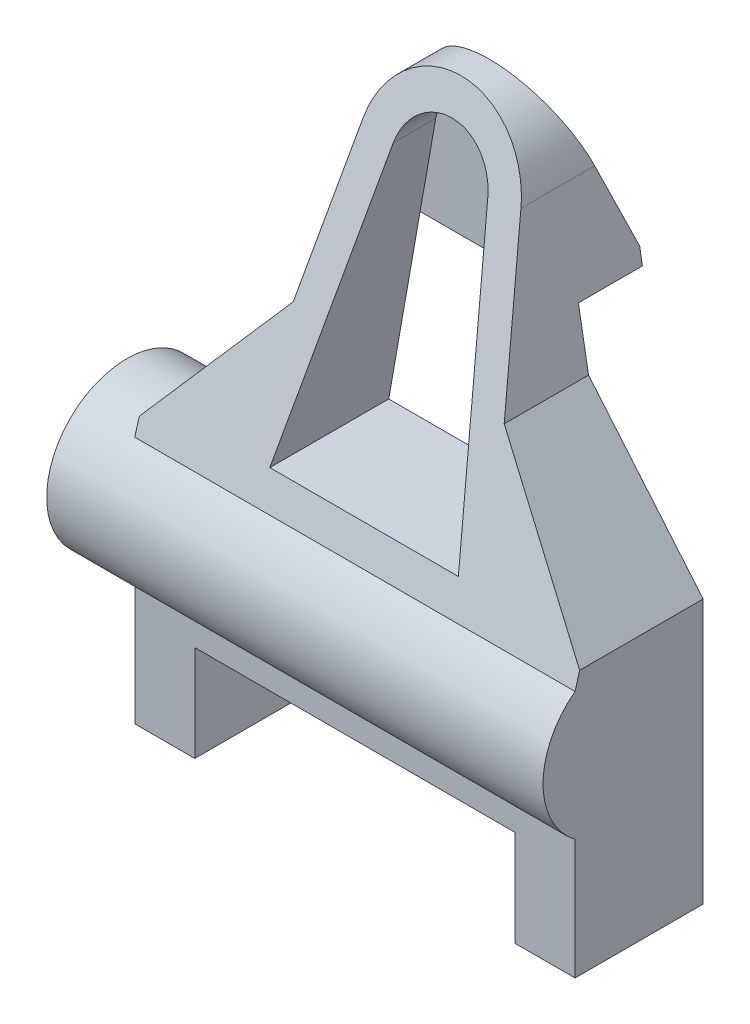
ISO-10303-21;
HEADER;
FILE_DESCRIPTION(('STEP AP214'),'2;1');
FILE_NAME('part.step','',(''),(''),'','','');
FILE_SCHEMA(('AUTOMOTIVE_DESIGN { 1 0 10303 214 1 1 1 1 }'));
ENDSEC;
DATA;
#1=APPLICATION_CONTEXT('core data for automotive mechanical design processes');
#2=APPLICATION_PROTOCOL_DEFINITION('international standard','automotive_design',2000,#1);
#3=PRODUCT_CONTEXT('',#1,'mechanical');
#4=PRODUCT('Part','Part','',(#3));
#5=PRODUCT_RELATED_PRODUCT_CATEGORY('part','',(#4));
#6=PRODUCT_DEFINITION_FORMATION('','',#4);
#7=PRODUCT_DEFINITION_CONTEXT('part definition',#1,'design');
#8=PRODUCT_DEFINITION('design','',#6,#7);
#9=PRODUCT_DEFINITION_SHAPE('','',#8);
#10=(LENGTH_UNIT() NAMED_UNIT(*) SI_UNIT(.MILLI.,.METRE.));
#11=(NAMED_UNIT(*) PLANE_ANGLE_UNIT() SI_UNIT($,.RADIAN.));
#12=(NAMED_UNIT(*) SI_UNIT($,.STERADIAN.) SOLID_ANGLE_UNIT());
#13=UNCERTAINTY_MEASURE_WITH_UNIT(LENGTH_MEASURE(1.E-05),#10,'distance_accuracy_value','');
#14=(GEOMETRIC_REPRESENTATION_CONTEXT(3) GLOBAL_UNCERTAINTY_ASSIGNED_CONTEXT((#13)) GLOBAL_UNIT_ASSIGNED_CONTEXT((#10,
#11,#12)) REPRESENTATION_CONTEXT('',''));
#15=CARTESIAN_POINT('',(0.,0.,0.));
#16=DIRECTION('',(0.,0.,1.));
#17=DIRECTION('',(1.,0.,0.));
#18=AXIS2_PLACEMENT_3D('',#15,#16,#17);
#19=CARTESIAN_POINT('',(77.5000000000003,4.77395900588817E-12,-8.27116153345742E-12));
#20=DIRECTION('',(-1.,0.,0.));
#21=DIRECTION('',(0.,0.,1.));
#22=AXIS2_PLACEMENT_3D('',#19,#20,#21);
#23=PLANE('',#22);
#24=CARTESIAN_POINT('',(77.5000000000003,4.77395900588817E-12,-8.27116153345742E-12));
#25=DIRECTION('',(-1.,0.,0.));
#26=DIRECTION('',(0.,0.,1.));
#27=AXIS2_PLACEMENT_3D('',#24,#25,#26);
#28=CIRCLE('',#27,5.50000000000007);
#29=CARTESIAN_POINT('',(77.5000000000003,4.77395900588817E-12,5.4999999999918));
#30=VERTEX_POINT('',#29);
#31=EDGE_CURVE('E19',#30,#30,#28,.T.);
#32=ORIENTED_EDGE('',*,*,#31,.T.);
#33=EDGE_LOOP('',(#32));
#34=FACE_BOUND('',#33,.T.);
#35=ADVANCED_FACE('F16',(#34),#23,.T.);
#36=CARTESIAN_POINT('',(77.5000000000003,4.77395900588817E-12,-8.27116153345742E-12));
#37=DIRECTION('',(-1.,0.,0.));
#38=DIRECTION('',(0.,0.,1.));
#39=AXIS2_PLACEMENT_3D('',#36,#37,#38);
#40=CYLINDRICAL_SURFACE('',#39,5.50000000000007);
#41=CARTESIAN_POINT('',(76.4999999999998,4.7740145170394E-12,-8.27159521432641E-12));
#42=DIRECTION('',(-1.,0.,0.));
#43=DIRECTION('',(0.,0.,1.));
#44=AXIS2_PLACEMENT_3D('',#41,#42,#43);
#45=CIRCLE('',#44,5.50000000000007);
#46=CARTESIAN_POINT('',(76.4999999999998,4.7740145170394E-12,5.4999999999918));
#47=VERTEX_POINT('',#46);
#48=EDGE_CURVE('E304',#47,#47,#45,.F.);
#49=ORIENTED_EDGE('',*,*,#48,.F.);
#50=EDGE_LOOP('',(#49));
#51=FACE_BOUND('',#50,.T.);
#52=ORIENTED_EDGE('',*,*,#31,.F.);
#53=EDGE_LOOP('',(#52));
#54=FACE_BOUND('',#53,.T.);
#55=ADVANCED_FACE('F312',(#51,#54),#40,.F.);
#56=CARTESIAN_POINT('',(76.4999999999998,4.77395900588817E-12,-8.27116153345742E-12));
#57=DIRECTION('',(-1.,0.,0.));
#58=DIRECTION('',(0.,0.,1.));
#59=AXIS2_PLACEMENT_3D('',#56,#57,#58);
#60=PLANE('',#59);
#61=CARTESIAN_POINT('',(76.4999999999998,4.77395900588817E-12,-8.27116153345742E-12));
#62=DIRECTION('',(-1.,0.,0.));
#63=DIRECTION('',(0.,0.,1.));
#64=AXIS2_PLACEMENT_3D('',#61,#62,#63);
#65=CIRCLE('',#64,6.50000000000009);
#66=CARTESIAN_POINT('',(76.4999999999998,4.77395900588817E-12,6.49999999999182));
#67=VERTEX_POINT('',#66);
#68=EDGE_CURVE('E302',#67,#67,#65,.T.);
#69=ORIENTED_EDGE('',*,*,#68,.T.);
#70=EDGE_LOOP('',(#69));
#71=FACE_BOUND('',#70,.T.);
#72=ORIENTED_EDGE('',*,*,#48,.T.);
#73=EDGE_LOOP('',(#72));
#74=FACE_BOUND('',#73,.T.);
#75=ADVANCED_FACE('F314',(#71,#74),#60,.T.);
#76=CARTESIAN_POINT('',(76.4999999999998,4.77395900588817E-12,-8.27116153345742E-12));
#77=DIRECTION('',(-1.,0.,0.));
#78=DIRECTION('',(0.,0.,1.));
#79=AXIS2_PLACEMENT_3D('',#76,#77,#78);
#80=CYLINDRICAL_SURFACE('',#79,6.50000000000009);
#81=CARTESIAN_POINT('',(71.4999999999999,4.77423656164433E-12,-8.27332993780239E-12));
#82=DIRECTION('',(-1.,0.,0.));
#83=DIRECTION('',(0.,0.,1.));
#84=AXIS2_PLACEMENT_3D('',#81,#82,#83);
#85=CIRCLE('',#84,6.50000000000009);
#86=CARTESIAN_POINT('',(71.4999999999999,4.77423656164433E-12,6.49999999999181));
#87=VERTEX_POINT('',#86);
#88=EDGE_CURVE('E299',#87,#87,#85,.F.);
#89=ORIENTED_EDGE('',*,*,#88,.F.);
#90=EDGE_LOOP('',(#89));
#91=FACE_BOUND('',#90,.T.);
#92=ORIENTED_EDGE('',*,*,#68,.F.);
#93=EDGE_LOOP('',(#92));
#94=FACE_BOUND('',#93,.T.);
#95=ADVANCED_FACE('F321',(#91,#94),#80,.F.);
#96=CARTESIAN_POINT('',(71.4999999999999,4.66293670342566E-12,-6.49480469405717E-12));
#97=DIRECTION('',(-1.,0.,0.));
#98=DIRECTION('',(0.,0.,1.));
#99=AXIS2_PLACEMENT_3D('',#96,#97,#98);
#100=PLANE('',#99);
#101=CARTESIAN_POINT('',(71.4999999999999,4.66293670342566E-12,-6.49480469405717E-12));
#102=DIRECTION('',(-1.,0.,0.));
#103=DIRECTION('',(0.,0.,1.));
#104=AXIS2_PLACEMENT_3D('',#101,#102,#103);
#105=CIRCLE('',#104,9.00000000000012);
#106=CARTESIAN_POINT('',(71.4999999999999,4.66293670342566E-12,8.99999999999362));
#107=VERTEX_POINT('',#106);
#108=EDGE_CURVE('E296',#107,#107,#105,.T.);
#109=ORIENTED_EDGE('',*,*,#108,.T.);
#110=EDGE_LOOP('',(#109));
#111=FACE_BOUND('',#110,.T.);
#112=ORIENTED_EDGE('',*,*,#88,.T.);
#113=EDGE_LOOP('',(#112));
#114=FACE_BOUND('',#113,.T.);
#115=ADVANCED_FACE('F434',(#111,#114),#100,.T.);
#116=CARTESIAN_POINT('',(71.4999999999999,4.66293670342566E-12,-6.49480469405717E-12));
#117=DIRECTION('',(-1.,0.,0.));
#118=DIRECTION('',(0.,0.,1.));
#119=AXIS2_PLACEMENT_3D('',#116,#117,#118);
#120=CYLINDRICAL_SURFACE('',#119,9.00000000000012);
#121=CARTESIAN_POINT('',(20.5000000000004,4.66576777213845E-12,-6.51692241837587E-12));
#122=DIRECTION('',(-1.,0.,0.));
#123=DIRECTION('',(0.,0.,1.));
#124=AXIS2_PLACEMENT_3D('',#121,#122,#123);
#125=CIRCLE('',#124,9.00000000000012);
#126=CARTESIAN_POINT('',(20.5000000000004,4.66576777213845E-12,8.9999999999936));
#127=VERTEX_POINT('',#126);
#128=EDGE_CURVE('E216',#127,#127,#125,.F.);
#129=ORIENTED_EDGE('',*,*,#128,.F.);
#130=EDGE_LOOP('',(#129));
#131=FACE_BOUND('',#130,.T.);
#132=ORIENTED_EDGE('',*,*,#108,.F.);
#133=EDGE_LOOP('',(#132));
#134=FACE_BOUND('',#133,.T.);
#135=ADVANCED_FACE('F430',(#131,#134),#120,.F.);
#136=CARTESIAN_POINT('',(20.5000000000004,0.,-5.99520433297585E-12));
#137=DIRECTION('',(-1.,0.,0.));
#138=DIRECTION('',(0.,0.,1.));
#139=AXIS2_PLACEMENT_3D('',#136,#137,#138);
#140=PLANE('',#139);
#141=CARTESIAN_POINT('',(20.5000000000004,0.,-5.99520433297585E-12));
#142=DIRECTION('',(1.,0.,0.));
#143=DIRECTION('',(0.,0.,-1.));
#144=AXIS2_PLACEMENT_3D('',#141,#142,#143);
#145=CIRCLE('',#144,10.0000000000001);
#146=CARTESIAN_POINT('',(20.5000000000004,0.,-10.0000000000061));
#147=VERTEX_POINT('',#146);
#148=EDGE_CURVE('E191',#147,#147,#145,.T.);
#149=ORIENTED_EDGE('',*,*,#148,.F.);
#150=EDGE_LOOP('',(#149));
#151=FACE_BOUND('',#150,.T.);
#152=ORIENTED_EDGE('',*,*,#128,.T.);
#153=EDGE_LOOP('',(#152));
#154=FACE_BOUND('',#153,.T.);
#155=ADVANCED_FACE('F426',(#151,#154),#140,.T.);
#156=CARTESIAN_POINT('',(55.0000000000003,44.2401960784322,-10.0000000000046));
#157=DIRECTION('',(0.,0.,1.));
#158=DIRECTION('',(1.,0.,0.));
#159=AXIS2_PLACEMENT_3D('',#156,#157,#158);
#160=CYLINDRICAL_SURFACE('',#159,6.);
#161=CARTESIAN_POINT('',(55.0000000000003,44.2401960784322,-9.99999999999828));
#162=DIRECTION('',(0.,0.,1.));
#163=DIRECTION('',(1.,0.,0.));
#164=AXIS2_PLACEMENT_3D('',#161,#162,#163);
#165=CIRCLE('',#164,6.);
#166=CARTESIAN_POINT('',(60.9088465180742,45.2820851444379,-9.99999999999576));
#167=VERTEX_POINT('',#166);
#168=CARTESIAN_POINT('',(49.0911534819261,45.2820851444336,-10.0000000000009));
#169=VERTEX_POINT('',#168);
#170=EDGE_CURVE('E275',#167,#169,#165,.T.);
#171=ORIENTED_EDGE('',*,*,#170,.F.);
#172=DIRECTION('',(0.,0.,1.));
#173=VECTOR('',#172,1.);
#174=CARTESIAN_POINT('',(60.9088465180735,45.2820851444418,-9.99999999999829));
#175=LINE('',#174,#173);
#176=CARTESIAN_POINT('',(60.9088465180735,45.2820851444378,-4.69046588663639));
#177=VERTEX_POINT('',#176);
#178=EDGE_CURVE('E262',#167,#177,#175,.T.);
#179=ORIENTED_EDGE('',*,*,#178,.T.);
#180=CARTESIAN_POINT('',(55.0000000000003,44.2401960784322,-4.39170900448593));
#181=DIRECTION('',(0.,-0.275637355816987,-0.961261695938322));
#182=DIRECTION('',(0.,-0.961261695938322,0.275637355816987));
#183=AXIS2_PLACEMENT_3D('',#180,#181,#182);
#184=ELLIPSE('',#183,6.24179661516959,6.);
#185=CARTESIAN_POINT('',(49.0911534819266,45.2820851444335,-4.69046588663648));
#186=VERTEX_POINT('',#185);
#187=EDGE_CURVE('E190',#177,#186,#184,.F.);
#188=ORIENTED_EDGE('',*,*,#187,.T.);
#189=DIRECTION('',(0.,0.,1.));
#190=VECTOR('',#189,1.);
#191=CARTESIAN_POINT('',(49.091153481926,45.2820851444333,-10.0000000000017));
#192=LINE('',#191,#190);
#193=EDGE_CURVE('E274',#186,#169,#192,.F.);
#194=ORIENTED_EDGE('',*,*,#193,.T.);
#195=EDGE_LOOP('',(#171,#179,#188,#194));
#196=FACE_BOUND('',#195,.T.);
#197=ADVANCED_FACE('F422',(#196),#160,.F.);
#198=CARTESIAN_POINT('',(-98.8059770101617,-7.99999999999446,6.00000000000234));
#199=DIRECTION('',(0.,0.,-1.));
#200=DIRECTION('',(-1.,0.,0.));
#201=AXIS2_PLACEMENT_3D('',#198,#199,#200);
#202=PLANE('',#201);
#203=DIRECTION('',(0.,1.,0.));
#204=VECTOR('',#203,1.);
#205=CARTESIAN_POINT('',(35.0000000000003,-59.3467831059166,5.9999999999934));
#206=LINE('',#205,#204);
#207=CARTESIAN_POINT('',(35.0000000000003,-22.9999999999961,5.99999999999577));
#208=VERTEX_POINT('',#207);
#209=CARTESIAN_POINT('',(35.0000000000003,-10.9999999999956,5.9999999999981));
#210=VERTEX_POINT('',#209);
#211=EDGE_CURVE('E217',#208,#210,#206,.T.);
#212=ORIENTED_EDGE('',*,*,#211,.T.);
#213=DIRECTION('',(1.,0.,0.));
#214=VECTOR('',#213,1.);
#215=CARTESIAN_POINT('',(35.,-10.9999999999978,6.0000000000075));
#216=LINE('',#215,#214);
#217=CARTESIAN_POINT('',(75.0000000000004,-10.9999999999978,6.00000000000685));
#218=VERTEX_POINT('',#217);
#219=EDGE_CURVE('E222',#210,#218,#216,.T.);
#220=ORIENTED_EDGE('',*,*,#219,.T.);
#221=DIRECTION('',(0.,1.,0.));
#222=VECTOR('',#221,1.);
#223=CARTESIAN_POINT('',(75.0000000000002,-59.3467831059185,6.00000000000556));
#224=LINE('',#223,#222);
#225=CARTESIAN_POINT('',(75.0000000000003,-22.999999999996,6.0000000000026));
#226=VERTEX_POINT('',#225);
#227=EDGE_CURVE('E224',#218,#226,#224,.F.);
#228=ORIENTED_EDGE('',*,*,#227,.T.);
#229=DIRECTION('',(1.,0.,0.));
#230=VECTOR('',#229,1.);
#231=CARTESIAN_POINT('',(27.4999999999993,-22.9999999999961,5.99999999999667));
#232=LINE('',#231,#230);
#233=CARTESIAN_POINT('',(82.5,-22.9999999999959,5.99999999999825));
#234=VERTEX_POINT('',#233);
#235=EDGE_CURVE('E232',#226,#234,#232,.T.);
#236=ORIENTED_EDGE('',*,*,#235,.T.);
#237=DIRECTION('',(0.,1.,0.));
#238=VECTOR('',#237,1.);
#239=CARTESIAN_POINT('',(82.5000000000001,-22.9999999999956,6.00000000000139));
#240=LINE('',#239,#238);
#241=CARTESIAN_POINT('',(82.5,-7.99999999999422,6.00000000000191));
#242=VERTEX_POINT('',#241);
#243=EDGE_CURVE('E287',#234,#242,#240,.T.);
#244=ORIENTED_EDGE('',*,*,#243,.T.);
#245=DIRECTION('',(-1.,0.,0.));
#246=VECTOR('',#245,1.);
#247=CARTESIAN_POINT('',(-98.8059770101617,-7.99999999999379,6.00000000000234));
#248=LINE('',#247,#246);
#249=CARTESIAN_POINT('',(27.4999999999999,-7.99999999999527,6.00000000000048));
#250=VERTEX_POINT('',#249);
#251=EDGE_CURVE('E214',#250,#242,#248,.F.);
#252=ORIENTED_EDGE('',*,*,#251,.F.);
#253=DIRECTION('',(0.,1.,0.));
#254=VECTOR('',#253,1.);
#255=CARTESIAN_POINT('',(27.4999999999999,10.0000000000033,5.99999999999856));
#256=LINE('',#255,#254);
#257=CARTESIAN_POINT('',(27.4999999999999,-22.999999999996,5.99999999999803));
#258=VERTEX_POINT('',#257);
#259=EDGE_CURVE('E285',#250,#258,#256,.F.);
#260=ORIENTED_EDGE('',*,*,#259,.T.);
#261=DIRECTION('',(1.,0.,0.));
#262=VECTOR('',#261,1.);
#263=CARTESIAN_POINT('',(27.4999999999993,-22.9999999999961,5.99999999999695));
#264=LINE('',#263,#262);
#265=EDGE_CURVE('E208',#258,#208,#264,.T.);
#266=ORIENTED_EDGE('',*,*,#265,.T.);
#267=EDGE_LOOP('',(#212,#220,#228,#236,#244,#252,#260,#266));
#268=FACE_BOUND('',#267,.T.);
#269=ADVANCED_FACE('F418',(#268),#202,.F.);
#270=CARTESIAN_POINT('',(20.5000000000004,0.,-5.99520433297585E-12));
#271=DIRECTION('',(1.,0.,0.));
#272=DIRECTION('',(0.,0.,-1.));
#273=AXIS2_PLACEMENT_3D('',#270,#271,#272);
#274=CYLINDRICAL_SURFACE('',#273,10.0000000000001);
#275=ORIENTED_EDGE('',*,*,#148,.T.);
#276=EDGE_LOOP('',(#275));
#277=FACE_BOUND('',#276,.T.);
#278=CARTESIAN_POINT('',(27.4999999999999,0.,-5.99216856689289E-12));
#279=DIRECTION('',(1.,0.,0.));
#280=DIRECTION('',(0.,0.,-1.));
#281=AXIS2_PLACEMENT_3D('',#278,#279,#280);
#282=CIRCLE('',#281,10.0000000000001);
#283=CARTESIAN_POINT('',(27.4999999999999,10.0000000000023,-6.63271142902876E-13));
#284=VERTEX_POINT('',#283);
#285=CARTESIAN_POINT('',(27.4999999999999,2.8863855749961E-12,-10.0000000000054));
#286=VERTEX_POINT('',#285);
#287=EDGE_CURVE('E279',#284,#286,#282,.F.);
#288=ORIENTED_EDGE('',*,*,#287,.T.);
#289=CARTESIAN_POINT('',(27.4999999999999,0.,-5.99216856689289E-12));
#290=DIRECTION('',(1.,0.,0.));
#291=DIRECTION('',(0.,0.,-1.));
#292=AXIS2_PLACEMENT_3D('',#289,#290,#291);
#293=CIRCLE('',#292,10.0000000000001);
#294=EDGE_CURVE('E283',#286,#250,#293,.F.);
#295=ORIENTED_EDGE('',*,*,#294,.T.);
#296=ORIENTED_EDGE('',*,*,#251,.T.);
#297=CARTESIAN_POINT('',(82.5,0.,-5.9683161190982E-12));
#298=DIRECTION('',(1.,0.,0.));
#299=DIRECTION('',(0.,0.,-1.));
#300=AXIS2_PLACEMENT_3D('',#297,#298,#299);
#301=CIRCLE('',#300,10.0000000000001);
#302=CARTESIAN_POINT('',(82.5,8.00000000000415,5.99999999999349));
#303=VERTEX_POINT('',#302);
#304=EDGE_CURVE('E176',#242,#303,#301,.F.);
#305=ORIENTED_EDGE('',*,*,#304,.T.);
#306=DIRECTION('',(1.,0.,0.));
#307=VECTOR('',#306,1.);
#308=CARTESIAN_POINT('',(-98.8059770101617,8.00000000000512,5.99999999999702));
#309=LINE('',#308,#307);
#310=CARTESIAN_POINT('',(27.4999999999999,8.00000000000054,5.99999999999831));
#311=VERTEX_POINT('',#310);
#312=EDGE_CURVE('E169',#303,#311,#309,.F.);
#313=ORIENTED_EDGE('',*,*,#312,.T.);
#314=CARTESIAN_POINT('',(27.4999999999999,0.,-5.99216856689289E-12));
#315=DIRECTION('',(1.,0.,0.));
#316=DIRECTION('',(0.,0.,-1.));
#317=AXIS2_PLACEMENT_3D('',#314,#315,#316);
#318=CIRCLE('',#317,10.0000000000001);
#319=EDGE_CURVE('E173',#311,#284,#318,.F.);
#320=ORIENTED_EDGE('',*,*,#319,.T.);
#321=EDGE_LOOP('',(#288,#295,#296,#305,#313,#320));
#322=FACE_BOUND('',#321,.T.);
#323=ADVANCED_FACE('F172',(#277,#322),#274,.T.);
#324=CARTESIAN_POINT('',(27.4999999999999,10.0000000000033,9.9999999999979));
#325=DIRECTION('',(1.,0.,0.));
#326=DIRECTION('',(0.,0.,-1.));
#327=AXIS2_PLACEMENT_3D('',#324,#325,#326);
#328=PLANE('',#327);
#329=DIRECTION('',(0.,0.961261695938322,-0.275637355816987));
#330=VECTOR('',#329,1.);
#331=CARTESIAN_POINT('',(27.4999999999999,8.000000000004,5.99999999999732));
#332=LINE('',#331,#330);
#333=CARTESIAN_POINT('',(27.5000000000002,10.0000000000035,5.42650922848301));
#334=VERTEX_POINT('',#333);
#335=EDGE_CURVE('E180',#311,#334,#332,.T.);
#336=ORIENTED_EDGE('',*,*,#335,.T.);
#337=DIRECTION('',(0.,0.,1.));
#338=VECTOR('',#337,1.);
#339=CARTESIAN_POINT('',(27.5000000000003,10.0000000000039,9.9999999999979));
#340=LINE('',#339,#338);
#341=EDGE_CURVE('E188',#334,#284,#340,.F.);
#342=ORIENTED_EDGE('',*,*,#341,.T.);
#343=ORIENTED_EDGE('',*,*,#319,.F.);
#344=EDGE_LOOP('',(#336,#342,#343));
#345=FACE_BOUND('',#344,.T.);
#346=ADVANCED_FACE('F185',(#345),#328,.F.);
#347=CARTESIAN_POINT('',(55.0000000000003,44.2401960784367,10.000000000001));
#348=DIRECTION('',(0.,0.,-1.));
#349=DIRECTION('',(-1.,0.,0.));
#350=AXIS2_PLACEMENT_3D('',#347,#348,#349);
#351=CYLINDRICAL_SURFACE('',#350,10.);
#352=CARTESIAN_POINT('',(55.0000000000003,44.2401960784367,-4.3917090044872));
#353=DIRECTION('',(0.,-0.275637355816987,-0.961261695938322));
#354=DIRECTION('',(0.,0.961261695938322,-0.275637355816987));
#355=AXIS2_PLACEMENT_3D('',#352,#353,#354);
#356=ELLIPSE('',#355,10.402994358616,10.);
#357=CARTESIAN_POINT('',(45.1519224698776,45.9766778551057,-4.88963714139607));
#358=VERTEX_POINT('',#357);
#359=CARTESIAN_POINT('',(64.8480775301221,45.9766778551037,-4.88963714139953));
#360=VERTEX_POINT('',#359);
#361=EDGE_CURVE('E181',#358,#360,#356,.T.);
#362=ORIENTED_EDGE('',*,*,#361,.T.);
#363=DIRECTION('',(0.,0.,1.));
#364=VECTOR('',#363,1.);
#365=CARTESIAN_POINT('',(64.8480775301218,45.9766778551013,9.99999999999473));
#366=LINE('',#365,#364);
#367=CARTESIAN_POINT('',(64.8480775301218,45.9766778551013,-14.1049598850533));
#368=VERTEX_POINT('',#367);
#369=EDGE_CURVE('E247',#360,#368,#366,.F.);
#370=ORIENTED_EDGE('',*,*,#369,.T.);
#371=CARTESIAN_POINT('',(55.0000000000003,44.2401960784367,-14.7985050279413));
#372=DIRECTION('',(0.,0.370907661604638,-0.928669751075687));
#373=DIRECTION('',(0.,-0.928669751075687,-0.370907661604638));
#374=AXIS2_PLACEMENT_3D('',#371,#372,#373);
#375=ELLIPSE('',#374,10.768090581627,10.);
#376=CARTESIAN_POINT('',(45.1519224698776,45.9766778551056,-14.1049598850547));
#377=VERTEX_POINT('',#376);
#378=EDGE_CURVE('E197',#377,#368,#375,.T.);
#379=ORIENTED_EDGE('',*,*,#378,.F.);
#380=DIRECTION('',(0.,0.,1.));
#381=VECTOR('',#380,1.);
#382=CARTESIAN_POINT('',(45.1519224698769,45.976677855105,10.));
#383=LINE('',#382,#381);
#384=EDGE_CURVE('E699',#377,#358,#383,.T.);
#385=ORIENTED_EDGE('',*,*,#384,.T.);
#386=EDGE_LOOP('',(#362,#370,#379,#385));
#387=FACE_BOUND('',#386,.T.);
#388=ADVANCED_FACE('F410',(#387),#351,.T.);
#389=CARTESIAN_POINT('',(-98.8059770101617,8.000000000004,5.99999999999734));
#390=DIRECTION('',(0.,-0.275637355816987,-0.961261695938322));
#391=DIRECTION('',(0.,0.961261695938322,-0.275637355816987));
#392=AXIS2_PLACEMENT_3D('',#389,#390,#391);
#393=PLANE('',#392);
#394=ORIENTED_EDGE('',*,*,#312,.F.);
#395=DIRECTION('',(0.,0.961261695940143,-0.275637355810636));
#396=VECTOR('',#395,1.);
#397=CARTESIAN_POINT('',(82.5000000000001,8.00000000000312,5.99999999999001));
#398=LINE('',#397,#396);
#399=CARTESIAN_POINT('',(82.4999999999996,10.0000000000049,5.42650922848608));
#400=VERTEX_POINT('',#399);
#401=EDGE_CURVE('E805',#303,#400,#398,.T.);
#402=ORIENTED_EDGE('',*,*,#401,.T.);
#403=DIRECTION('',(-0.627819760424347,0.748206454987355,-0.214544748563022));
#404=VECTOR('',#403,1.);
#405=CARTESIAN_POINT('',(82.4999999999987,10.0000000000041,5.42650922848609));
#406=LINE('',#405,#404);
#407=CARTESIAN_POINT('',(68.1832358499869,27.0620551101044,0.534043654092084));
#408=VERTEX_POINT('',#407);
#409=EDGE_CURVE('E238',#400,#408,#406,.T.);
#410=ORIENTED_EDGE('',*,*,#409,.T.);
#411=DIRECTION('',(-0.167112875584137,0.947744213124376,-0.271761279992678));
#412=VECTOR('',#411,1.);
#413=CARTESIAN_POINT('',(68.1832358499869,27.062055110103,0.534043654092209));
#414=LINE('',#413,#412);
#415=EDGE_CURVE('E244',#408,#360,#414,.T.);
#416=ORIENTED_EDGE('',*,*,#415,.T.);
#417=ORIENTED_EDGE('',*,*,#361,.F.);
#418=DIRECTION('',(-0.167112875584165,-0.947744213124537,0.271761279992097));
#419=VECTOR('',#418,1.);
#420=CARTESIAN_POINT('',(45.1519224698769,45.9766778551052,-4.88963714139073));
#421=LINE('',#420,#419);
#422=CARTESIAN_POINT('',(41.8167641500111,27.0620551101028,0.534043654087747));
#423=VERTEX_POINT('',#422);
#424=EDGE_CURVE('E701',#358,#423,#421,.T.);
#425=ORIENTED_EDGE('',*,*,#424,.T.);
#426=DIRECTION('',(-0.62781976042433,-0.748206454987332,0.214544748563153));
#427=VECTOR('',#426,1.);
#428=CARTESIAN_POINT('',(41.8167641500104,27.0620551101024,0.534043654088046));
#429=LINE('',#428,#427);
#430=EDGE_CURVE('E196',#423,#334,#429,.T.);
#431=ORIENTED_EDGE('',*,*,#430,.T.);
#432=ORIENTED_EDGE('',*,*,#335,.F.);
#433=EDGE_LOOP('',(#394,#402,#410,#416,#417,#425,#431,#432));
#434=FACE_BOUND('',#433,.T.);
#435=DIRECTION('',(1.,0.,0.));
#436=VECTOR('',#435,1.);
#437=CARTESIAN_POINT('',(43.222623896727,12.0000000000048,4.85301845696406));
#438=LINE('',#437,#436);
#439=CARTESIAN_POINT('',(66.7773761032742,12.0000000000039,4.85301845696406));
#440=VERTEX_POINT('',#439);
#441=CARTESIAN_POINT('',(43.2226238967267,12.000000000005,4.85301845696507));
#442=VERTEX_POINT('',#441);
#443=EDGE_CURVE('E266',#440,#442,#438,.F.);
#444=ORIENTED_EDGE('',*,*,#443,.T.);
#445=DIRECTION('',(0.167112875584109,0.947744213124218,-0.271761279993244));
#446=VECTOR('',#445,1.);
#447=CARTESIAN_POINT('',(43.2226238967268,12.0000000000033,4.85301845696774));
#448=LINE('',#447,#446);
#449=EDGE_CURVE('E271',#442,#186,#448,.T.);
#450=ORIENTED_EDGE('',*,*,#449,.T.);
#451=ORIENTED_EDGE('',*,*,#187,.F.);
#452=DIRECTION('',(0.167112875584118,-0.947744213124264,0.27176127999308));
#453=VECTOR('',#452,1.);
#454=CARTESIAN_POINT('',(60.9088465180746,45.2820851444357,-4.69046588663663));
#455=LINE('',#454,#453);
#456=EDGE_CURVE('E256',#177,#440,#455,.T.);
#457=ORIENTED_EDGE('',*,*,#456,.T.);
#458=EDGE_LOOP('',(#444,#450,#451,#457));
#459=FACE_BOUND('',#458,.T.);
#460=ADVANCED_FACE('F193',(#434,#459),#393,.F.);
#461=CARTESIAN_POINT('',(260.255959317303,59.0935715935432,-8.86611542134297));
#462=DIRECTION('',(0.,0.370907661604638,-0.928669751075687));
#463=DIRECTION('',(0.,0.928669751075687,0.370907661604638));
#464=AXIS2_PLACEMENT_3D('',#461,#462,#463);
#465=PLANE('',#464);
#466=DIRECTION('',(-1.,0.,0.));
#467=VECTOR('',#466,1.);
#468=CARTESIAN_POINT('',(55.0000000000005,36.2243693739779,-17.9999999999957));
#469=LINE('',#468,#467);
#470=CARTESIAN_POINT('',(43.4323273604623,36.2243693739752,-18.0000000000007));
#471=VERTEX_POINT('',#470);
#472=CARTESIAN_POINT('',(66.5676726395358,36.2243693739774,-17.9999999999947));
#473=VERTEX_POINT('',#472);
#474=EDGE_CURVE('E200',#471,#473,#469,.F.);
#475=ORIENTED_EDGE('',*,*,#474,.F.);
#476=DIRECTION('',(0.161597336850517,0.916464038579003,0.366032739948607));
#477=VECTOR('',#476,1.);
#478=CARTESIAN_POINT('',(43.4323273604623,36.2243693739781,-18.0000000000003));
#479=LINE('',#478,#477);
#480=EDGE_CURVE('E702',#471,#377,#479,.T.);
#481=ORIENTED_EDGE('',*,*,#480,.T.);
#482=ORIENTED_EDGE('',*,*,#378,.T.);
#483=DIRECTION('',(0.16159733685052,-0.916464038579007,-0.366032739948595));
#484=VECTOR('',#483,1.);
#485=CARTESIAN_POINT('',(64.8480775301219,45.9766778551006,-14.1049598850495));
#486=LINE('',#485,#484);
#487=EDGE_CURVE('E241',#368,#473,#486,.T.);
#488=ORIENTED_EDGE('',*,*,#487,.T.);
#489=EDGE_LOOP('',(#475,#481,#482,#488));
#490=FACE_BOUND('',#489,.T.);
#491=ADVANCED_FACE('F403',(#490),#465,.T.);
#492=CARTESIAN_POINT('',(55.0000000000005,44.2401960784335,-17.9999999999957));
#493=DIRECTION('',(0.,0.,-1.));
#494=DIRECTION('',(-1.,0.,0.));
#495=AXIS2_PLACEMENT_3D('',#492,#493,#494);
#496=PLANE('',#495);
#497=DIRECTION('',(0.173648177666927,-0.984807753012209,0.));
#498=VECTOR('',#497,1.);
#499=CARTESIAN_POINT('',(68.1832358499863,27.0620551101064,-17.9999999999942));
#500=LINE('',#499,#498);
#501=CARTESIAN_POINT('',(66.917535925941,34.240196078436,-18.0000000000052));
#502=VERTEX_POINT('',#501);
#503=EDGE_CURVE('E248',#473,#502,#500,.T.);
#504=ORIENTED_EDGE('',*,*,#503,.T.);
#505=DIRECTION('',(-1.,0.,0.));
#506=VECTOR('',#505,1.);
#507=CARTESIAN_POINT('',(66.9175359259409,34.240196078436,-18.0000000000106));
#508=LINE('',#507,#506);
#509=CARTESIAN_POINT('',(43.0824640740571,34.240196078436,-18.0000000000075));
#510=VERTEX_POINT('',#509);
#511=EDGE_CURVE('E694',#502,#510,#508,.T.);
#512=ORIENTED_EDGE('',*,*,#511,.T.);
#513=DIRECTION('',(0.173648177666926,0.984807753012209,0.));
#514=VECTOR('',#513,1.);
#515=CARTESIAN_POINT('',(41.8167641500124,27.06205511011,-18.0000000000043));
#516=LINE('',#515,#514);
#517=EDGE_CURVE('E705',#510,#471,#516,.T.);
#518=ORIENTED_EDGE('',*,*,#517,.T.);
#519=ORIENTED_EDGE('',*,*,#474,.T.);
#520=EDGE_LOOP('',(#504,#512,#518,#519));
#521=FACE_BOUND('',#520,.T.);
#522=ADVANCED_FACE('F399',(#521),#496,.T.);
#523=CARTESIAN_POINT('',(55.0000000000003,44.2401960784322,-10.0000000000046));
#524=DIRECTION('',(0.,0.,1.));
#525=DIRECTION('',(1.,0.,0.));
#526=AXIS2_PLACEMENT_3D('',#523,#524,#525);
#527=PLANE('',#526);
#528=ORIENTED_EDGE('',*,*,#170,.T.);
#529=DIRECTION('',(-0.173648177666926,-0.984807753012209,0.));
#530=VECTOR('',#529,1.);
#531=CARTESIAN_POINT('',(43.222623896727,12.0000000000048,-10.0000000000036));
#532=LINE('',#531,#530);
#533=CARTESIAN_POINT('',(47.1441705216005,34.2401960784359,-10.0000000000016));
#534=VERTEX_POINT('',#533);
#535=EDGE_CURVE('E268',#169,#534,#532,.T.);
#536=ORIENTED_EDGE('',*,*,#535,.T.);
#537=DIRECTION('',(-1.,0.,0.));
#538=VECTOR('',#537,1.);
#539=CARTESIAN_POINT('',(66.9175359259409,34.240196078436,-9.99999999999379));
#540=LINE('',#539,#538);
#541=CARTESIAN_POINT('',(62.8558294783986,34.2401960784371,-9.99999999999904));
#542=VERTEX_POINT('',#541);
#543=EDGE_CURVE('E662',#534,#542,#540,.F.);
#544=ORIENTED_EDGE('',*,*,#543,.T.);
#545=DIRECTION('',(-0.173648177666927,0.984807753012209,0.));
#546=VECTOR('',#545,1.);
#547=CARTESIAN_POINT('',(60.9088465180735,45.2820851444418,-9.99999999999324));
#548=LINE('',#547,#546);
#549=EDGE_CURVE('E265',#542,#167,#548,.T.);
#550=ORIENTED_EDGE('',*,*,#549,.T.);
#551=EDGE_LOOP('',(#528,#536,#544,#550));
#552=FACE_BOUND('',#551,.T.);
#553=ADVANCED_FACE('F395',(#552),#527,.T.);
#554=CARTESIAN_POINT('',(43.222623896727,12.0000000000048,-10.0000000000017));
#555=DIRECTION('',(-0.984807753012209,0.173648177666926,0.));
#556=DIRECTION('',(-0.173648177666926,-0.984807753012209,0.));
#557=AXIS2_PLACEMENT_3D('',#554,#555,#556);
#558=PLANE('',#557);
#559=DIRECTION('',(-0.173648177666901,-0.984807753012213,0.));
#560=VECTOR('',#559,1.);
#561=CARTESIAN_POINT('',(47.1441705216005,34.2401960784369,-10.0000000000046));
#562=LINE('',#561,#560);
#563=CARTESIAN_POINT('',(43.2226238967269,12.0000000000048,-10.0000000000046));
#564=VERTEX_POINT('',#563);
#565=EDGE_CURVE('E682',#534,#564,#562,.T.);
#566=ORIENTED_EDGE('',*,*,#565,.F.);
#567=ORIENTED_EDGE('',*,*,#535,.F.);
#568=ORIENTED_EDGE('',*,*,#193,.F.);
#569=ORIENTED_EDGE('',*,*,#449,.F.);
#570=DIRECTION('',(0.,0.,-1.));
#571=VECTOR('',#570,1.);
#572=CARTESIAN_POINT('',(43.2226238967265,12.0000000000048,-10.0000000000017));
#573=LINE('',#572,#571);
#574=EDGE_CURVE('E259',#442,#564,#573,.T.);
#575=ORIENTED_EDGE('',*,*,#574,.T.);
#576=EDGE_LOOP('',(#566,#567,#568,#569,#575));
#577=FACE_BOUND('',#576,.T.);
#578=ADVANCED_FACE('F391',(#577),#558,.F.);
#579=CARTESIAN_POINT('',(43.222623896727,12.0000000000048,-10.0000000000017));
#580=DIRECTION('',(0.,-1.,0.));
#581=DIRECTION('',(0.,0.,-1.));
#582=AXIS2_PLACEMENT_3D('',#579,#580,#581);
#583=PLANE('',#582);
#584=DIRECTION('',(-1.,0.,0.));
#585=VECTOR('',#584,1.);
#586=CARTESIAN_POINT('',(55.0000000000003,12.0000000000048,-10.0000000000046));
#587=LINE('',#586,#585);
#588=CARTESIAN_POINT('',(66.7773761032733,12.0000000000043,-10.0000000000046));
#589=VERTEX_POINT('',#588);
#590=EDGE_CURVE('E672',#564,#589,#587,.F.);
#591=ORIENTED_EDGE('',*,*,#590,.F.);
#592=ORIENTED_EDGE('',*,*,#574,.F.);
#593=ORIENTED_EDGE('',*,*,#443,.F.);
#594=DIRECTION('',(0.,0.,1.));
#595=VECTOR('',#594,1.);
#596=CARTESIAN_POINT('',(66.7773761032742,12.0000000000035,-9.99999999999829));
#597=LINE('',#596,#595);
#598=EDGE_CURVE('E258',#440,#589,#597,.F.);
#599=ORIENTED_EDGE('',*,*,#598,.T.);
#600=EDGE_LOOP('',(#591,#592,#593,#599));
#601=FACE_BOUND('',#600,.T.);
#602=ADVANCED_FACE('F387',(#601),#583,.F.);
#603=CARTESIAN_POINT('',(60.9088465180735,45.2820851444418,-9.99999999999829));
#604=DIRECTION('',(0.984807753012209,0.173648177666927,0.));
#605=DIRECTION('',(-0.173648177666927,0.984807753012209,0.));
#606=AXIS2_PLACEMENT_3D('',#603,#604,#605);
#607=PLANE('',#606);
#608=ORIENTED_EDGE('',*,*,#549,.F.);
#609=DIRECTION('',(-0.173648177666949,0.984807753012205,0.));
#610=VECTOR('',#609,1.);
#611=CARTESIAN_POINT('',(66.777376103273,12.000000000004,-10.0000000000046));
#612=LINE('',#611,#610);
#613=EDGE_CURVE('E827',#589,#542,#612,.T.);
#614=ORIENTED_EDGE('',*,*,#613,.F.);
#615=ORIENTED_EDGE('',*,*,#598,.F.);
#616=ORIENTED_EDGE('',*,*,#456,.F.);
#617=ORIENTED_EDGE('',*,*,#178,.F.);
#618=EDGE_LOOP('',(#608,#614,#615,#616,#617));
#619=FACE_BOUND('',#618,.T.);
#620=ADVANCED_FACE('F383',(#619),#607,.F.);
#621=CARTESIAN_POINT('',(68.1832358499863,27.0620551101064,9.99999999999473));
#622=DIRECTION('',(-0.984807753012209,-0.173648177666927,0.));
#623=DIRECTION('',(0.173648177666927,-0.984807753012209,0.));
#624=AXIS2_PLACEMENT_3D('',#621,#622,#623);
#625=PLANE('',#624);
#626=ORIENTED_EDGE('',*,*,#369,.F.);
#627=ORIENTED_EDGE('',*,*,#415,.F.);
#628=DIRECTION('',(0.,0.,1.));
#629=VECTOR('',#628,1.);
#630=CARTESIAN_POINT('',(68.1832358499871,27.0620551101044,9.99999999999679));
#631=LINE('',#630,#629);
#632=CARTESIAN_POINT('',(68.1832358499865,27.062055110105,-10.0000000000046));
#633=VERTEX_POINT('',#632);
#634=EDGE_CURVE('E240',#408,#633,#631,.F.);
#635=ORIENTED_EDGE('',*,*,#634,.T.);
#636=DIRECTION('',(0.173648177666867,-0.984807753012219,0.));
#637=VECTOR('',#636,1.);
#638=CARTESIAN_POINT('',(66.917535925941,34.2401960784369,-10.0000000000046));
#639=LINE('',#638,#637);
#640=CARTESIAN_POINT('',(66.917535925941,34.2401960784369,-10.0000000000008));
#641=VERTEX_POINT('',#640);
#642=EDGE_CURVE('E814',#641,#633,#639,.T.);
#643=ORIENTED_EDGE('',*,*,#642,.F.);
#644=DIRECTION('',(0.,0.,1.));
#645=VECTOR('',#644,1.);
#646=CARTESIAN_POINT('',(66.917535925941,34.240196078436,-18.0000000000106));
#647=LINE('',#646,#645);
#648=EDGE_CURVE('E696',#641,#502,#647,.F.);
#649=ORIENTED_EDGE('',*,*,#648,.T.);
#650=ORIENTED_EDGE('',*,*,#503,.F.);
#651=ORIENTED_EDGE('',*,*,#487,.F.);
#652=EDGE_LOOP('',(#626,#627,#635,#643,#649,#650,#651));
#653=FACE_BOUND('',#652,.T.);
#654=ADVANCED_FACE('F379',(#653),#625,.F.);
#655=CARTESIAN_POINT('',(82.4999999999998,10.0000000000027,9.99999999999679));
#656=DIRECTION('',(-0.766044443118979,-0.642787609686538,0.));
#657=DIRECTION('',(0.642787609686538,-0.766044443118979,0.));
#658=AXIS2_PLACEMENT_3D('',#655,#656,#657);
#659=PLANE('',#658);
#660=ORIENTED_EDGE('',*,*,#409,.F.);
#661=DIRECTION('',(0.,0.,1.));
#662=VECTOR('',#661,1.);
#663=CARTESIAN_POINT('',(82.5000000000001,10.0000000000053,9.99999999999856));
#664=LINE('',#663,#662);
#665=CARTESIAN_POINT('',(82.5000000000004,10.0000000000056,-10.0000000000046));
#666=VERTEX_POINT('',#665);
#667=EDGE_CURVE('E802',#400,#666,#664,.F.);
#668=ORIENTED_EDGE('',*,*,#667,.T.);
#669=DIRECTION('',(0.642787609686629,-0.766044443118903,0.));
#670=VECTOR('',#669,1.);
#671=CARTESIAN_POINT('',(68.1832358499862,27.0620551101053,-10.0000000000046));
#672=LINE('',#671,#670);
#673=EDGE_CURVE('E797',#633,#666,#672,.T.);
#674=ORIENTED_EDGE('',*,*,#673,.F.);
#675=ORIENTED_EDGE('',*,*,#634,.F.);
#676=EDGE_LOOP('',(#660,#668,#674,#675));
#677=FACE_BOUND('',#676,.T.);
#678=ADVANCED_FACE('F375',(#677),#659,.F.);
#679=CARTESIAN_POINT('',(82.5000000000001,-22.9999999999956,9.99999999999856));
#680=DIRECTION('',(-1.,0.,0.));
#681=DIRECTION('',(0.,0.,1.));
#682=AXIS2_PLACEMENT_3D('',#679,#680,#681);
#683=PLANE('',#682);
#684=ORIENTED_EDGE('',*,*,#243,.F.);
#685=DIRECTION('',(0.,0.,1.));
#686=VECTOR('',#685,1.);
#687=CARTESIAN_POINT('',(82.5,-22.9999999999961,10.0000000000033));
#688=LINE('',#687,#686);
#689=CARTESIAN_POINT('',(82.5000000000004,-22.9999999999957,-10.0000000000046));
#690=VERTEX_POINT('',#689);
#691=EDGE_CURVE('E235',#234,#690,#688,.F.);
#692=ORIENTED_EDGE('',*,*,#691,.T.);
#693=DIRECTION('',(0.,1.,0.));
#694=VECTOR('',#693,1.);
#695=CARTESIAN_POINT('',(82.5000000000005,44.2401960784322,-10.0000000000046));
#696=LINE('',#695,#694);
#697=EDGE_CURVE('E789',#666,#690,#696,.F.);
#698=ORIENTED_EDGE('',*,*,#697,.F.);
#699=ORIENTED_EDGE('',*,*,#667,.F.);
#700=ORIENTED_EDGE('',*,*,#401,.F.);
#701=ORIENTED_EDGE('',*,*,#304,.F.);
#702=EDGE_LOOP('',(#684,#692,#698,#699,#700,#701));
#703=FACE_BOUND('',#702,.T.);
#704=ADVANCED_FACE('F371',(#703),#683,.F.);
#705=CARTESIAN_POINT('',(27.4999999999993,-22.9999999999961,10.0000000000033));
#706=DIRECTION('',(0.,1.,0.));
#707=DIRECTION('',(0.,0.,1.));
#708=AXIS2_PLACEMENT_3D('',#705,#706,#707);
#709=PLANE('',#708);
#710=DIRECTION('',(0.,0.,-1.));
#711=VECTOR('',#710,1.);
#712=CARTESIAN_POINT('',(75.0000000000002,-22.9999999999959,9.99999999998968));
#713=LINE('',#712,#711);
#714=CARTESIAN_POINT('',(75.0000000000004,-22.9999999999956,-10.0000000000046));
#715=VERTEX_POINT('',#714);
#716=EDGE_CURVE('E229',#226,#715,#713,.T.);
#717=ORIENTED_EDGE('',*,*,#716,.T.);
#718=DIRECTION('',(-1.,0.,0.));
#719=VECTOR('',#718,1.);
#720=CARTESIAN_POINT('',(55.0000000000003,-22.9999999999955,-10.0000000000046));
#721=LINE('',#720,#719);
#722=EDGE_CURVE('E781',#690,#715,#721,.T.);
#723=ORIENTED_EDGE('',*,*,#722,.F.);
#724=ORIENTED_EDGE('',*,*,#691,.F.);
#725=ORIENTED_EDGE('',*,*,#235,.F.);
#726=EDGE_LOOP('',(#717,#723,#724,#725));
#727=FACE_BOUND('',#726,.T.);
#728=ADVANCED_FACE('F367',(#727),#709,.F.);
#729=CARTESIAN_POINT('',(75.0000000000002,-59.3467831059185,9.99999999998968));
#730=DIRECTION('',(1.,0.,0.));
#731=DIRECTION('',(0.,0.,-1.));
#732=AXIS2_PLACEMENT_3D('',#729,#730,#731);
#733=PLANE('',#732);
#734=DIRECTION('',(0.,0.,1.));
#735=VECTOR('',#734,1.);
#736=CARTESIAN_POINT('',(75.0000000000005,-10.9999999999978,9.9999999999994));
#737=LINE('',#736,#735);
#738=CARTESIAN_POINT('',(75.0000000000005,-10.9999999999939,-10.0000000000046));
#739=VERTEX_POINT('',#738);
#740=EDGE_CURVE('E219',#218,#739,#737,.F.);
#741=ORIENTED_EDGE('',*,*,#740,.T.);
#742=DIRECTION('',(0.,1.,0.));
#743=VECTOR('',#742,1.);
#744=CARTESIAN_POINT('',(75.0000000000005,44.2401960784322,-10.0000000000046));
#745=LINE('',#744,#743);
#746=EDGE_CURVE('E773',#715,#739,#745,.T.);
#747=ORIENTED_EDGE('',*,*,#746,.F.);
#748=ORIENTED_EDGE('',*,*,#716,.F.);
#749=ORIENTED_EDGE('',*,*,#227,.F.);
#750=EDGE_LOOP('',(#741,#747,#748,#749));
#751=FACE_BOUND('',#750,.T.);
#752=ADVANCED_FACE('F363',(#751),#733,.F.);
#753=CARTESIAN_POINT('',(35.,-10.9999999999978,9.9999999999994));
#754=DIRECTION('',(0.,1.,0.));
#755=DIRECTION('',(0.,0.,1.));
#756=AXIS2_PLACEMENT_3D('',#753,#754,#755);
#757=PLANE('',#756);
#758=DIRECTION('',(-1.,0.,0.));
#759=VECTOR('',#758,1.);
#760=CARTESIAN_POINT('',(55.0000000000003,-10.9999999999919,-10.0000000000046));
#761=LINE('',#760,#759);
#762=CARTESIAN_POINT('',(35.0000000000005,-10.9999999999928,-10.0000000000046));
#763=VERTEX_POINT('',#762);
#764=EDGE_CURVE('E765',#739,#763,#761,.T.);
#765=ORIENTED_EDGE('',*,*,#764,.F.);
#766=ORIENTED_EDGE('',*,*,#740,.F.);
#767=ORIENTED_EDGE('',*,*,#219,.F.);
#768=DIRECTION('',(0.,0.,1.));
#769=VECTOR('',#768,1.);
#770=CARTESIAN_POINT('',(35.0000000000003,-10.9999999999946,9.99999999999646));
#771=LINE('',#770,#769);
#772=EDGE_CURVE('E211',#210,#763,#771,.F.);
#773=ORIENTED_EDGE('',*,*,#772,.T.);
#774=EDGE_LOOP('',(#765,#766,#767,#773));
#775=FACE_BOUND('',#774,.T.);
#776=ADVANCED_FACE('F359',(#775),#757,.F.);
#777=CARTESIAN_POINT('',(35.0000000000003,-59.3467831059166,9.99999999999646));
#778=DIRECTION('',(-1.,0.,0.));
#779=DIRECTION('',(0.,0.,1.));
#780=AXIS2_PLACEMENT_3D('',#777,#778,#779);
#781=PLANE('',#780);
#782=ORIENTED_EDGE('',*,*,#772,.F.);
#783=ORIENTED_EDGE('',*,*,#211,.F.);
#784=DIRECTION('',(0.,0.,1.));
#785=VECTOR('',#784,1.);
#786=CARTESIAN_POINT('',(35.0000000000003,-22.9999999999961,10.0000000000033));
#787=LINE('',#786,#785);
#788=CARTESIAN_POINT('',(35.0000000000005,-22.9999999999944,-10.0000000000046));
#789=VERTEX_POINT('',#788);
#790=EDGE_CURVE('E210',#208,#789,#787,.F.);
#791=ORIENTED_EDGE('',*,*,#790,.T.);
#792=DIRECTION('',(0.,1.,0.));
#793=VECTOR('',#792,1.);
#794=CARTESIAN_POINT('',(35.0000000000006,44.2401960784322,-10.0000000000046));
#795=LINE('',#794,#793);
#796=EDGE_CURVE('E757',#763,#789,#795,.F.);
#797=ORIENTED_EDGE('',*,*,#796,.F.);
#798=EDGE_LOOP('',(#782,#783,#791,#797));
#799=FACE_BOUND('',#798,.T.);
#800=ADVANCED_FACE('F355',(#799),#781,.F.);
#801=CARTESIAN_POINT('',(27.4999999999993,-22.9999999999961,10.0000000000033));
#802=DIRECTION('',(0.,1.,0.));
#803=DIRECTION('',(0.,0.,1.));
#804=AXIS2_PLACEMENT_3D('',#801,#802,#803);
#805=PLANE('',#804);
#806=ORIENTED_EDGE('',*,*,#790,.F.);
#807=ORIENTED_EDGE('',*,*,#265,.F.);
#808=DIRECTION('',(0.,0.,-1.));
#809=VECTOR('',#808,1.);
#810=CARTESIAN_POINT('',(27.4999999999999,-22.9999999999959,9.9999999999979));
#811=LINE('',#810,#809);
#812=CARTESIAN_POINT('',(27.5000000000004,-22.9999999999943,-10.0000000000046));
#813=VERTEX_POINT('',#812);
#814=EDGE_CURVE('E282',#258,#813,#811,.T.);
#815=ORIENTED_EDGE('',*,*,#814,.T.);
#816=DIRECTION('',(-1.,0.,0.));
#817=VECTOR('',#816,1.);
#818=CARTESIAN_POINT('',(55.0000000000003,-22.9999999999935,-10.0000000000046));
#819=LINE('',#818,#817);
#820=EDGE_CURVE('E754',#789,#813,#819,.T.);
#821=ORIENTED_EDGE('',*,*,#820,.F.);
#822=EDGE_LOOP('',(#806,#807,#815,#821));
#823=FACE_BOUND('',#822,.T.);
#824=ADVANCED_FACE('F351',(#823),#805,.F.);
#825=CARTESIAN_POINT('',(27.4999999999999,10.0000000000033,9.9999999999979));
#826=DIRECTION('',(1.,0.,0.));
#827=DIRECTION('',(0.,0.,-1.));
#828=AXIS2_PLACEMENT_3D('',#825,#826,#827);
#829=PLANE('',#828);
#830=ORIENTED_EDGE('',*,*,#259,.F.);
#831=ORIENTED_EDGE('',*,*,#294,.F.);
#832=DIRECTION('',(0.,1.,0.));
#833=VECTOR('',#832,1.);
#834=CARTESIAN_POINT('',(27.5000000000007,44.2401960784322,-10.0000000000046));
#835=LINE('',#834,#833);
#836=EDGE_CURVE('E738',#813,#286,#835,.T.);
#837=ORIENTED_EDGE('',*,*,#836,.F.);
#838=ORIENTED_EDGE('',*,*,#814,.F.);
#839=EDGE_LOOP('',(#830,#831,#837,#838));
#840=FACE_BOUND('',#839,.T.);
#841=ADVANCED_FACE('F347',(#840),#829,.F.);
#842=CARTESIAN_POINT('',(27.4999999999999,10.0000000000033,9.9999999999979));
#843=DIRECTION('',(1.,0.,0.));
#844=DIRECTION('',(0.,0.,-1.));
#845=AXIS2_PLACEMENT_3D('',#842,#843,#844);
#846=PLANE('',#845);
#847=DIRECTION('',(0.,0.,1.));
#848=VECTOR('',#847,1.);
#849=CARTESIAN_POINT('',(27.5000000000007,10.0000000000044,9.9999999999979));
#850=LINE('',#849,#848);
#851=CARTESIAN_POINT('',(27.5000000000002,10.000000000005,-10.0000000000032));
#852=VERTEX_POINT('',#851);
#853=EDGE_CURVE('E281',#284,#852,#850,.F.);
#854=ORIENTED_EDGE('',*,*,#853,.T.);
#855=DIRECTION('',(0.,1.,0.));
#856=VECTOR('',#855,1.);
#857=CARTESIAN_POINT('',(27.5,44.2401960784322,-10.0000000000046));
#858=LINE('',#857,#856);
#859=EDGE_CURVE('E736',#286,#852,#858,.T.);
#860=ORIENTED_EDGE('',*,*,#859,.F.);
#861=ORIENTED_EDGE('',*,*,#287,.F.);
#862=EDGE_LOOP('',(#854,#860,#861));
#863=FACE_BOUND('',#862,.T.);
#864=ADVANCED_FACE('F343',(#863),#846,.F.);
#865=CARTESIAN_POINT('',(27.4999999999999,10.0000000000033,9.9999999999979));
#866=DIRECTION('',(0.766044443118978,-0.642787609686539,0.));
#867=DIRECTION('',(0.642787609686539,0.766044443118978,0.));
#868=AXIS2_PLACEMENT_3D('',#865,#866,#867);
#869=PLANE('',#868);
#870=ORIENTED_EDGE('',*,*,#430,.F.);
#871=DIRECTION('',(0.,0.,1.));
#872=VECTOR('',#871,1.);
#873=CARTESIAN_POINT('',(41.8167641500109,27.062055110102,10.));
#874=LINE('',#873,#872);
#875=CARTESIAN_POINT('',(41.8167641500116,27.0620551101038,-10.0000000000034));
#876=VERTEX_POINT('',#875);
#877=EDGE_CURVE('E710',#423,#876,#874,.F.);
#878=ORIENTED_EDGE('',*,*,#877,.T.);
#879=DIRECTION('',(0.64278760968657,0.766044443118952,0.));
#880=VECTOR('',#879,1.);
#881=CARTESIAN_POINT('',(27.5,10.0000000000058,-10.0000000000046));
#882=LINE('',#881,#880);
#883=EDGE_CURVE('E730',#852,#876,#882,.T.);
#884=ORIENTED_EDGE('',*,*,#883,.F.);
#885=ORIENTED_EDGE('',*,*,#853,.F.);
#886=ORIENTED_EDGE('',*,*,#341,.F.);
#887=EDGE_LOOP('',(#870,#878,#884,#885,#886));
#888=FACE_BOUND('',#887,.T.);
#889=ADVANCED_FACE('F340',(#888),#869,.F.);
#890=CARTESIAN_POINT('',(41.8167641500123,27.06205511011,10.));
#891=DIRECTION('',(0.984807753012209,-0.173648177666926,0.));
#892=DIRECTION('',(0.173648177666926,0.984807753012209,0.));
#893=AXIS2_PLACEMENT_3D('',#890,#891,#892);
#894=PLANE('',#893);
#895=ORIENTED_EDGE('',*,*,#517,.F.);
#896=DIRECTION('',(0.,0.,1.));
#897=VECTOR('',#896,1.);
#898=CARTESIAN_POINT('',(43.0824640740577,34.240196078436,-18.0000000000106));
#899=LINE('',#898,#897);
#900=CARTESIAN_POINT('',(43.0824640740573,34.2401960784359,-10.0000000000005));
#901=VERTEX_POINT('',#900);
#902=EDGE_CURVE('E34',#510,#901,#899,.T.);
#903=ORIENTED_EDGE('',*,*,#902,.T.);
#904=DIRECTION('',(0.173648177667012,0.984807753012193,0.));
#905=VECTOR('',#904,1.);
#906=CARTESIAN_POINT('',(41.8167641500115,27.0620551101046,-10.0000000000046));
#907=LINE('',#906,#905);
#908=EDGE_CURVE('E25',#876,#901,#907,.T.);
#909=ORIENTED_EDGE('',*,*,#908,.F.);
#910=ORIENTED_EDGE('',*,*,#877,.F.);
#911=ORIENTED_EDGE('',*,*,#424,.F.);
#912=ORIENTED_EDGE('',*,*,#384,.F.);
#913=ORIENTED_EDGE('',*,*,#480,.F.);
#914=EDGE_LOOP('',(#895,#903,#909,#910,#911,#912,#913));
#915=FACE_BOUND('',#914,.T.);
#916=ADVANCED_FACE('F333',(#915),#894,.F.);
#917=CARTESIAN_POINT('',(66.9175359259409,34.240196078436,-18.0000000000106));
#918=DIRECTION('',(0.,1.,0.));
#919=DIRECTION('',(-1.,0.,0.));
#920=AXIS2_PLACEMENT_3D('',#917,#918,#919);
#921=PLANE('',#920);
#922=ORIENTED_EDGE('',*,*,#543,.F.);
#923=DIRECTION('',(-1.,0.,0.));
#924=VECTOR('',#923,1.);
#925=CARTESIAN_POINT('',(55.0000000000003,34.2401960784358,-10.0000000000046));
#926=LINE('',#925,#924);
#927=EDGE_CURVE('E11',#901,#534,#926,.F.);
#928=ORIENTED_EDGE('',*,*,#927,.F.);
#929=ORIENTED_EDGE('',*,*,#902,.F.);
#930=ORIENTED_EDGE('',*,*,#511,.F.);
#931=ORIENTED_EDGE('',*,*,#648,.F.);
#932=DIRECTION('',(-1.,0.,0.));
#933=VECTOR('',#932,1.);
#934=CARTESIAN_POINT('',(55.0000000000003,34.2401960784373,-10.0000000000046));
#935=LINE('',#934,#933);
#936=EDGE_CURVE('E822',#542,#641,#935,.F.);
#937=ORIENTED_EDGE('',*,*,#936,.F.);
#938=EDGE_LOOP('',(#922,#928,#929,#930,#931,#937));
#939=FACE_BOUND('',#938,.T.);
#940=ADVANCED_FACE('F327',(#939),#921,.F.);
#941=CARTESIAN_POINT('',(55.0000000000003,44.2401960784322,-10.0000000000046));
#942=DIRECTION('',(0.,0.,-1.));
#943=DIRECTION('',(-1.,0.,0.));
#944=AXIS2_PLACEMENT_3D('',#941,#942,#943);
#945=PLANE('',#944);
#946=ORIENTED_EDGE('',*,*,#908,.T.);
#947=ORIENTED_EDGE('',*,*,#927,.T.);
#948=ORIENTED_EDGE('',*,*,#565,.T.);
#949=ORIENTED_EDGE('',*,*,#590,.T.);
#950=ORIENTED_EDGE('',*,*,#613,.T.);
#951=ORIENTED_EDGE('',*,*,#936,.T.);
#952=ORIENTED_EDGE('',*,*,#642,.T.);
#953=ORIENTED_EDGE('',*,*,#673,.T.);
#954=ORIENTED_EDGE('',*,*,#697,.T.);
#955=ORIENTED_EDGE('',*,*,#722,.T.);
#956=ORIENTED_EDGE('',*,*,#746,.T.);
#957=ORIENTED_EDGE('',*,*,#764,.T.);
#958=ORIENTED_EDGE('',*,*,#796,.T.);
#959=ORIENTED_EDGE('',*,*,#820,.T.);
#960=ORIENTED_EDGE('',*,*,#836,.T.);
#961=ORIENTED_EDGE('',*,*,#859,.T.);
#962=ORIENTED_EDGE('',*,*,#883,.T.);
#963=EDGE_LOOP('',(#946,#947,#948,#949,#950,#951,#952,#953,#954,#955,#956,#957,#958,#959,#960,
#961,#962));
#964=FACE_BOUND('',#963,.T.);
#965=ADVANCED_FACE('F325',(#964),#945,.T.);
#966=CLOSED_SHELL('',(#35,#55,#75,#95,#115,#135,#155,#197,#269,#323,#346,#388,#460,#491,#522,
#553,#578,#602,#620,#654,#678,#704,#728,#752,#776,#800,#824,#841,#864,#889,#916,#940,#965));
#967=MANIFOLD_SOLID_BREP('B1',#966);
#968=ADVANCED_BREP_SHAPE_REPRESENTATION('',(#18,#967),#14);
#969=SHAPE_DEFINITION_REPRESENTATION(#9,#968);
ENDSEC;
END-ISO-10303-21;
